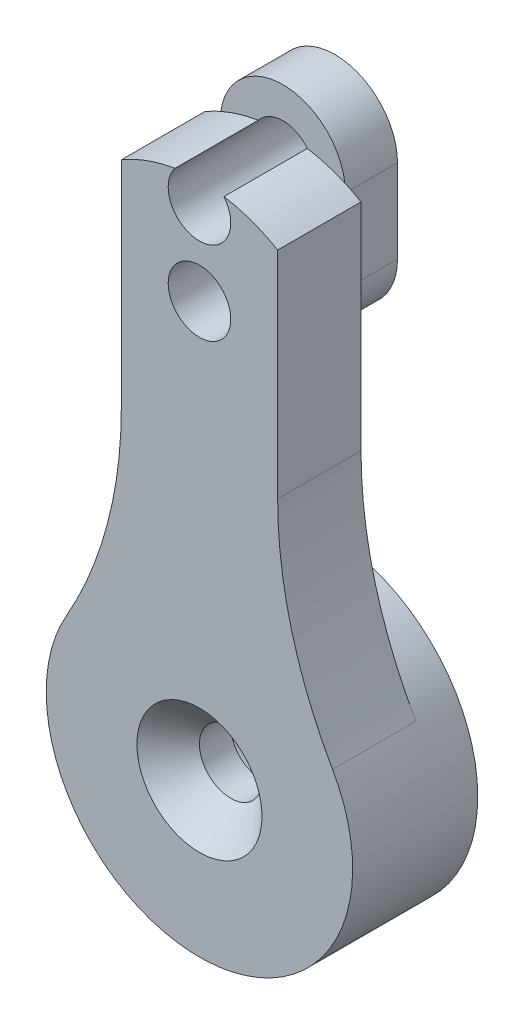
ISO-10303-21;
HEADER;
FILE_DESCRIPTION(('STEP AP214'),'2;1');
FILE_NAME('part.step','',(''),(''),'','','');
FILE_SCHEMA(('AUTOMOTIVE_DESIGN { 1 0 10303 214 1 1 1 1 }'));
ENDSEC;
DATA;
#1=APPLICATION_CONTEXT('core data for automotive mechanical design processes');
#2=APPLICATION_PROTOCOL_DEFINITION('international standard','automotive_design',2000,#1);
#3=PRODUCT_CONTEXT('',#1,'mechanical');
#4=PRODUCT('Part','Part','',(#3));
#5=PRODUCT_RELATED_PRODUCT_CATEGORY('part','',(#4));
#6=PRODUCT_DEFINITION_FORMATION('','',#4);
#7=PRODUCT_DEFINITION_CONTEXT('part definition',#1,'design');
#8=PRODUCT_DEFINITION('design','',#6,#7);
#9=PRODUCT_DEFINITION_SHAPE('','',#8);
#10=(LENGTH_UNIT() NAMED_UNIT(*) SI_UNIT(.MILLI.,.METRE.));
#11=(NAMED_UNIT(*) PLANE_ANGLE_UNIT() SI_UNIT($,.RADIAN.));
#12=(NAMED_UNIT(*) SI_UNIT($,.STERADIAN.) SOLID_ANGLE_UNIT());
#13=UNCERTAINTY_MEASURE_WITH_UNIT(LENGTH_MEASURE(1.E-05),#10,'distance_accuracy_value','');
#14=(GEOMETRIC_REPRESENTATION_CONTEXT(3) GLOBAL_UNCERTAINTY_ASSIGNED_CONTEXT((#13)) GLOBAL_UNIT_ASSIGNED_CONTEXT((#10,
#11,#12)) REPRESENTATION_CONTEXT('',''));
#15=CARTESIAN_POINT('',(0.,0.,0.));
#16=DIRECTION('',(0.,0.,1.));
#17=DIRECTION('',(1.,0.,0.));
#18=AXIS2_PLACEMENT_3D('',#15,#16,#17);
#19=CARTESIAN_POINT('',(7.35,0.,4.));
#20=DIRECTION('',(0.,0.,1.));
#21=DIRECTION('',(1.,0.,0.));
#22=AXIS2_PLACEMENT_3D('',#19,#20,#21);
#23=PLANE('',#22);
#24=CARTESIAN_POINT('',(0.,0.,4.00000000000001));
#25=DIRECTION('',(0.,0.,-1.));
#26=DIRECTION('',(-1.,0.,0.));
#27=AXIS2_PLACEMENT_3D('',#24,#25,#26);
#28=CIRCLE('',#27,3.);
#29=CARTESIAN_POINT('',(-3.,0.,4.00000000000001));
#30=VERTEX_POINT('',#29);
#31=EDGE_CURVE('E326',#30,#30,#28,.T.);
#32=ORIENTED_EDGE('',*,*,#31,.T.);
#33=EDGE_LOOP('',(#32));
#34=FACE_BOUND('',#33,.T.);
#35=CARTESIAN_POINT('',(0.,19.9,4.00000000000001));
#36=DIRECTION('',(0.,0.,-1.));
#37=DIRECTION('',(-1.,0.,0.));
#38=AXIS2_PLACEMENT_3D('',#35,#36,#37);
#39=CIRCLE('',#38,1.49999999999999);
#40=CARTESIAN_POINT('',(-1.49999999999999,19.9,4.00000000000001));
#41=VERTEX_POINT('',#40);
#42=EDGE_CURVE('E297',#41,#41,#39,.T.);
#43=ORIENTED_EDGE('',*,*,#42,.T.);
#44=EDGE_LOOP('',(#43));
#45=FACE_BOUND('',#44,.T.);
#46=CARTESIAN_POINT('',(0.,17.5786077482884,4.));
#47=DIRECTION('',(0.,0.,-1.));
#48=DIRECTION('',(-1.,0.,0.));
#49=AXIS2_PLACEMENT_3D('',#46,#47,#48);
#50=CIRCLE('',#49,7.35);
#51=CARTESIAN_POINT('',(1.1734701980635,24.8343274020689,4.00000000000001));
#52=VERTEX_POINT('',#51);
#53=CARTESIAN_POINT('',(3.75,23.9,4.));
#54=VERTEX_POINT('',#53);
#55=EDGE_CURVE('E156',#52,#54,#50,.T.);
#56=ORIENTED_EDGE('',*,*,#55,.F.);
#57=CARTESIAN_POINT('',(0.,23.9,4.00000000000001));
#58=DIRECTION('',(0.,0.,-1.));
#59=DIRECTION('',(-1.,0.,0.));
#60=AXIS2_PLACEMENT_3D('',#57,#58,#59);
#61=CIRCLE('',#60,1.49999999999999);
#62=CARTESIAN_POINT('',(-1.1734701980635,24.8343274020689,4.00000000000001));
#63=VERTEX_POINT('',#62);
#64=EDGE_CURVE('E140',#52,#63,#61,.T.);
#65=ORIENTED_EDGE('',*,*,#64,.T.);
#66=CARTESIAN_POINT('',(-3.75,23.9,4.));
#67=VERTEX_POINT('',#66);
#68=EDGE_CURVE('E154',#67,#63,#50,.T.);
#69=ORIENTED_EDGE('',*,*,#68,.F.);
#70=DIRECTION('',(0.,1.,0.));
#71=VECTOR('',#70,1.);
#72=CARTESIAN_POINT('',(-3.75,6.32139225171164,4.));
#73=LINE('',#72,#71);
#74=CARTESIAN_POINT('',(-3.75,13.5631854665488,4.));
#75=VERTEX_POINT('',#74);
#76=EDGE_CURVE('E166',#75,#67,#73,.T.);
#77=ORIENTED_EDGE('',*,*,#76,.F.);
#78=CARTESIAN_POINT('',(-23.75,13.5631854665488,4.));
#79=DIRECTION('',(0.,0.,1.));
#80=DIRECTION('',(1.,0.,0.));
#81=AXIS2_PLACEMENT_3D('',#78,#79,#80);
#82=CIRCLE('',#81,20.);
#83=CARTESIAN_POINT('',(-6.38254113345521,3.64495112172335,4.));
#84=VERTEX_POINT('',#83);
#85=EDGE_CURVE('E11',#75,#84,#82,.F.);
#86=ORIENTED_EDGE('',*,*,#85,.T.);
#87=CARTESIAN_POINT('',(0.,0.,4.));
#88=DIRECTION('',(0.,0.,-1.));
#89=DIRECTION('',(-1.,0.,0.));
#90=AXIS2_PLACEMENT_3D('',#87,#88,#89);
#91=CIRCLE('',#90,7.35);
#92=CARTESIAN_POINT('',(6.38254113345521,3.64495112172335,4.));
#93=VERTEX_POINT('',#92);
#94=EDGE_CURVE('E191',#93,#84,#91,.T.);
#95=ORIENTED_EDGE('',*,*,#94,.F.);
#96=CARTESIAN_POINT('',(23.75,13.5631854665488,4.));
#97=DIRECTION('',(0.,0.,1.));
#98=DIRECTION('',(1.,0.,0.));
#99=AXIS2_PLACEMENT_3D('',#96,#97,#98);
#100=CIRCLE('',#99,20.);
#101=CARTESIAN_POINT('',(3.75,13.5631854665488,4.));
#102=VERTEX_POINT('',#101);
#103=EDGE_CURVE('E217',#93,#102,#100,.F.);
#104=ORIENTED_EDGE('',*,*,#103,.T.);
#105=DIRECTION('',(0.,1.,0.));
#106=VECTOR('',#105,1.);
#107=CARTESIAN_POINT('',(3.75,6.32139225171164,4.));
#108=LINE('',#107,#106);
#109=EDGE_CURVE('E170',#102,#54,#108,.T.);
#110=ORIENTED_EDGE('',*,*,#109,.T.);
#111=EDGE_LOOP('',(#56,#65,#69,#77,#86,#95,#104,#110));
#112=FACE_BOUND('',#111,.T.);
#113=ADVANCED_FACE('F43',(#34,#45,#112),#23,.T.);
#114=CARTESIAN_POINT('',(0.,17.5786077482884,4.));
#115=DIRECTION('',(0.,0.,-1.));
#116=DIRECTION('',(-1.,0.,0.));
#117=AXIS2_PLACEMENT_3D('',#114,#115,#116);
#118=CYLINDRICAL_SURFACE('',#117,7.35);
#119=DIRECTION('',(0.,0.,-1.));
#120=VECTOR('',#119,1.);
#121=CARTESIAN_POINT('',(1.1734701980635,24.8343274020689,0.750000000000002));
#122=LINE('',#121,#120);
#123=CARTESIAN_POINT('',(1.1734701980635,24.8343274020689,0.));
#124=VERTEX_POINT('',#123);
#125=EDGE_CURVE('E148',#52,#124,#122,.T.);
#126=ORIENTED_EDGE('',*,*,#125,.F.);
#127=ORIENTED_EDGE('',*,*,#55,.T.);
#128=DIRECTION('',(0.,0.,-1.));
#129=VECTOR('',#128,1.);
#130=CARTESIAN_POINT('',(3.75,23.9,4.));
#131=LINE('',#130,#129);
#132=CARTESIAN_POINT('',(3.75,23.9,0.));
#133=VERTEX_POINT('',#132);
#134=EDGE_CURVE('E175',#54,#133,#131,.T.);
#135=ORIENTED_EDGE('',*,*,#134,.T.);
#136=CARTESIAN_POINT('',(0.,17.5786077482884,0.));
#137=DIRECTION('',(0.,0.,1.));
#138=DIRECTION('',(1.,0.,0.));
#139=AXIS2_PLACEMENT_3D('',#136,#137,#138);
#140=CIRCLE('',#139,7.35);
#141=CARTESIAN_POINT('',(2.97315640270276,24.3004260294581,0.));
#142=VERTEX_POINT('',#141);
#143=EDGE_CURVE('E224',#133,#142,#140,.T.);
#144=ORIENTED_EDGE('',*,*,#143,.T.);
#145=EDGE_CURVE('E228',#142,#124,#140,.T.);
#146=ORIENTED_EDGE('',*,*,#145,.T.);
#147=EDGE_LOOP('',(#126,#127,#135,#144,#146));
#148=FACE_BOUND('',#147,.T.);
#149=ADVANCED_FACE('F238',(#148),#118,.T.);
#150=CARTESIAN_POINT('',(-3.75,6.32139225171164,0.));
#151=DIRECTION('',(0.,0.,-1.));
#152=DIRECTION('',(-1.,0.,0.));
#153=AXIS2_PLACEMENT_3D('',#150,#151,#152);
#154=PLANE('',#153);
#155=DIRECTION('',(0.,-1.,0.));
#156=VECTOR('',#155,1.);
#157=CARTESIAN_POINT('',(3.,19.9,0.));
#158=LINE('',#157,#156);
#159=CARTESIAN_POINT('',(3.,23.9,0.));
#160=VERTEX_POINT('',#159);
#161=CARTESIAN_POINT('',(3.,19.9,0.));
#162=VERTEX_POINT('',#161);
#163=EDGE_CURVE('E245',#160,#162,#158,.T.);
#164=ORIENTED_EDGE('',*,*,#163,.F.);
#165=CARTESIAN_POINT('',(0.,23.9,0.));
#166=DIRECTION('',(0.,0.,-1.));
#167=DIRECTION('',(-1.,0.,0.));
#168=AXIS2_PLACEMENT_3D('',#165,#166,#167);
#169=CIRCLE('',#168,3.);
#170=EDGE_CURVE('E149',#160,#142,#169,.F.);
#171=ORIENTED_EDGE('',*,*,#170,.T.);
#172=ORIENTED_EDGE('',*,*,#143,.F.);
#173=DIRECTION('',(0.,1.,0.));
#174=VECTOR('',#173,1.);
#175=CARTESIAN_POINT('',(3.75,6.32139225171164,0.));
#176=LINE('',#175,#174);
#177=CARTESIAN_POINT('',(3.75,13.5631854665488,0.));
#178=VERTEX_POINT('',#177);
#179=EDGE_CURVE('E179',#178,#133,#176,.T.);
#180=ORIENTED_EDGE('',*,*,#179,.F.);
#181=CARTESIAN_POINT('',(23.75,13.5631854665488,0.));
#182=DIRECTION('',(0.,0.,-1.));
#183=DIRECTION('',(-1.,0.,0.));
#184=AXIS2_PLACEMENT_3D('',#181,#182,#183);
#185=CIRCLE('',#184,20.);
#186=CARTESIAN_POINT('',(6.38254113345521,3.64495112172335,0.));
#187=VERTEX_POINT('',#186);
#188=EDGE_CURVE('E213',#178,#187,#185,.F.);
#189=ORIENTED_EDGE('',*,*,#188,.T.);
#190=CARTESIAN_POINT('',(0.,0.,0.));
#191=DIRECTION('',(0.,0.,1.));
#192=DIRECTION('',(1.,0.,0.));
#193=AXIS2_PLACEMENT_3D('',#190,#191,#192);
#194=CIRCLE('',#193,7.35);
#195=CARTESIAN_POINT('',(-6.38254113345521,3.64495112172335,0.));
#196=VERTEX_POINT('',#195);
#197=EDGE_CURVE('E185',#187,#196,#194,.T.);
#198=ORIENTED_EDGE('',*,*,#197,.T.);
#199=CARTESIAN_POINT('',(-23.75,13.5631854665488,0.));
#200=DIRECTION('',(0.,0.,-1.));
#201=DIRECTION('',(-1.,0.,0.));
#202=AXIS2_PLACEMENT_3D('',#199,#200,#201);
#203=CIRCLE('',#202,20.);
#204=CARTESIAN_POINT('',(-3.75,13.5631854665488,0.));
#205=VERTEX_POINT('',#204);
#206=EDGE_CURVE('E52',#196,#205,#203,.F.);
#207=ORIENTED_EDGE('',*,*,#206,.T.);
#208=DIRECTION('',(0.,1.,0.));
#209=VECTOR('',#208,1.);
#210=CARTESIAN_POINT('',(-3.75,6.32139225171164,0.));
#211=LINE('',#210,#209);
#212=CARTESIAN_POINT('',(-3.75,23.9,0.));
#213=VERTEX_POINT('',#212);
#214=EDGE_CURVE('E183',#205,#213,#211,.T.);
#215=ORIENTED_EDGE('',*,*,#214,.T.);
#216=CARTESIAN_POINT('',(-2.97315640270276,24.3004260294581,0.));
#217=VERTEX_POINT('',#216);
#218=EDGE_CURVE('E182',#217,#213,#140,.T.);
#219=ORIENTED_EDGE('',*,*,#218,.F.);
#220=CARTESIAN_POINT('',(0.,23.9,0.));
#221=DIRECTION('',(0.,0.,-1.));
#222=DIRECTION('',(1.,0.,0.));
#223=AXIS2_PLACEMENT_3D('',#220,#221,#222);
#224=CIRCLE('',#223,3.);
#225=CARTESIAN_POINT('',(-3.,23.9,0.));
#226=VERTEX_POINT('',#225);
#227=EDGE_CURVE('E285',#226,#217,#224,.T.);
#228=ORIENTED_EDGE('',*,*,#227,.F.);
#229=DIRECTION('',(0.,1.,0.));
#230=VECTOR('',#229,1.);
#231=CARTESIAN_POINT('',(-3.,23.9,0.));
#232=LINE('',#231,#230);
#233=CARTESIAN_POINT('',(-3.,19.9,0.));
#234=VERTEX_POINT('',#233);
#235=EDGE_CURVE('E275',#234,#226,#232,.T.);
#236=ORIENTED_EDGE('',*,*,#235,.F.);
#237=CARTESIAN_POINT('',(0.,19.9,0.));
#238=DIRECTION('',(0.,0.,-1.));
#239=DIRECTION('',(1.,0.,0.));
#240=AXIS2_PLACEMENT_3D('',#237,#238,#239);
#241=CIRCLE('',#240,3.);
#242=EDGE_CURVE('E279',#162,#234,#241,.T.);
#243=ORIENTED_EDGE('',*,*,#242,.F.);
#244=EDGE_LOOP('',(#164,#171,#172,#180,#189,#198,#207,#215,#219,#228,#236,#243));
#245=FACE_BOUND('',#244,.T.);
#246=ADVANCED_FACE('F243',(#245),#154,.T.);
#247=CARTESIAN_POINT('',(0.,0.,4.));
#248=DIRECTION('',(0.,0.,-1.));
#249=DIRECTION('',(-1.,0.,0.));
#250=AXIS2_PLACEMENT_3D('',#247,#248,#249);
#251=CYLINDRICAL_SURFACE('',#250,7.35);
#252=ORIENTED_EDGE('',*,*,#197,.F.);
#253=DIRECTION('',(0.,0.,-1.));
#254=VECTOR('',#253,1.);
#255=CARTESIAN_POINT('',(6.38254113345521,3.64495112172335,4.));
#256=LINE('',#255,#254);
#257=EDGE_CURVE('E208',#187,#93,#256,.F.);
#258=ORIENTED_EDGE('',*,*,#257,.T.);
#259=ORIENTED_EDGE('',*,*,#94,.T.);
#260=DIRECTION('',(0.,0.,-1.));
#261=VECTOR('',#260,1.);
#262=CARTESIAN_POINT('',(-6.38254113345521,3.64495112172335,4.));
#263=LINE('',#262,#261);
#264=EDGE_CURVE('E204',#84,#196,#263,.T.);
#265=ORIENTED_EDGE('',*,*,#264,.T.);
#266=EDGE_LOOP('',(#252,#258,#259,#265));
#267=FACE_BOUND('',#266,.T.);
#268=CARTESIAN_POINT('',(0.,0.,-2.));
#269=DIRECTION('',(0.,0.,-1.));
#270=DIRECTION('',(-1.,0.,0.));
#271=AXIS2_PLACEMENT_3D('',#268,#269,#270);
#272=CIRCLE('',#271,7.35);
#273=CARTESIAN_POINT('',(-7.35,0.,-2.));
#274=VERTEX_POINT('',#273);
#275=EDGE_CURVE('E187',#274,#274,#272,.T.);
#276=ORIENTED_EDGE('',*,*,#275,.F.);
#277=EDGE_LOOP('',(#276));
#278=FACE_BOUND('',#277,.T.);
#279=ADVANCED_FACE('F361',(#267,#278),#251,.T.);
#280=CARTESIAN_POINT('',(0.,0.,-2.));
#281=DIRECTION('',(0.,0.,-1.));
#282=DIRECTION('',(-1.,0.,0.));
#283=AXIS2_PLACEMENT_3D('',#280,#281,#282);
#284=PLANE('',#283);
#285=CARTESIAN_POINT('',(0.,0.,-2.));
#286=DIRECTION('',(0.,0.,-1.));
#287=DIRECTION('',(-1.,0.,0.));
#288=AXIS2_PLACEMENT_3D('',#285,#286,#287);
#289=CIRCLE('',#288,3.);
#290=CARTESIAN_POINT('',(-3.,0.,-2.));
#291=VERTEX_POINT('',#290);
#292=EDGE_CURVE('E322',#291,#291,#289,.T.);
#293=ORIENTED_EDGE('',*,*,#292,.F.);
#294=EDGE_LOOP('',(#293));
#295=FACE_BOUND('',#294,.T.);
#296=ORIENTED_EDGE('',*,*,#275,.T.);
#297=EDGE_LOOP('',(#296));
#298=FACE_BOUND('',#297,.T.);
#299=ADVANCED_FACE('F358',(#295,#298),#284,.T.);
#300=DIRECTION('',(0.,0.,-1.));
#301=VECTOR('',#300,1.);
#302=CARTESIAN_POINT('',(-1.1734701980635,24.8343274020689,0.750000000000002));
#303=LINE('',#302,#301);
#304=CARTESIAN_POINT('',(-1.1734701980635,24.8343274020689,0.));
#305=VERTEX_POINT('',#304);
#306=EDGE_CURVE('E136',#305,#63,#303,.F.);
#307=ORIENTED_EDGE('',*,*,#306,.F.);
#308=EDGE_CURVE('E229',#305,#217,#140,.T.);
#309=ORIENTED_EDGE('',*,*,#308,.T.);
#310=ORIENTED_EDGE('',*,*,#218,.T.);
#311=DIRECTION('',(0.,0.,-1.));
#312=VECTOR('',#311,1.);
#313=CARTESIAN_POINT('',(-3.75,23.9,4.));
#314=LINE('',#313,#312);
#315=EDGE_CURVE('E164',#67,#213,#314,.T.);
#316=ORIENTED_EDGE('',*,*,#315,.F.);
#317=ORIENTED_EDGE('',*,*,#68,.T.);
#318=EDGE_LOOP('',(#307,#309,#310,#316,#317));
#319=FACE_BOUND('',#318,.T.);
#320=ADVANCED_FACE('F161',(#319),#118,.T.);
#321=CARTESIAN_POINT('',(3.75,6.32139225171164,4.));
#322=DIRECTION('',(1.,0.,0.));
#323=DIRECTION('',(0.,0.,-1.));
#324=AXIS2_PLACEMENT_3D('',#321,#322,#323);
#325=PLANE('',#324);
#326=ORIENTED_EDGE('',*,*,#109,.F.);
#327=DIRECTION('',(0.,0.,1.));
#328=VECTOR('',#327,1.);
#329=CARTESIAN_POINT('',(3.75,13.5631854665488,0.));
#330=LINE('',#329,#328);
#331=EDGE_CURVE('E200',#102,#178,#330,.F.);
#332=ORIENTED_EDGE('',*,*,#331,.T.);
#333=ORIENTED_EDGE('',*,*,#179,.T.);
#334=ORIENTED_EDGE('',*,*,#134,.F.);
#335=EDGE_LOOP('',(#326,#332,#333,#334));
#336=FACE_BOUND('',#335,.T.);
#337=ADVANCED_FACE('F381',(#336),#325,.T.);
#338=CARTESIAN_POINT('',(-3.75,6.32139225171164,4.));
#339=DIRECTION('',(1.,0.,0.));
#340=DIRECTION('',(0.,0.,-1.));
#341=AXIS2_PLACEMENT_3D('',#338,#339,#340);
#342=PLANE('',#341);
#343=ORIENTED_EDGE('',*,*,#214,.F.);
#344=DIRECTION('',(0.,0.,-1.));
#345=VECTOR('',#344,1.);
#346=CARTESIAN_POINT('',(-3.75,13.5631854665488,4.));
#347=LINE('',#346,#345);
#348=EDGE_CURVE('E59',#205,#75,#347,.F.);
#349=ORIENTED_EDGE('',*,*,#348,.T.);
#350=ORIENTED_EDGE('',*,*,#76,.T.);
#351=ORIENTED_EDGE('',*,*,#315,.T.);
#352=EDGE_LOOP('',(#343,#349,#350,#351));
#353=FACE_BOUND('',#352,.T.);
#354=ADVANCED_FACE('F363',(#353),#342,.F.);
#355=CARTESIAN_POINT('',(0.,23.9,-2.5));
#356=DIRECTION('',(0.,0.,1.));
#357=DIRECTION('',(1.,0.,0.));
#358=AXIS2_PLACEMENT_3D('',#355,#356,#357);
#359=CYLINDRICAL_SURFACE('',#358,3.);
#360=ORIENTED_EDGE('',*,*,#227,.T.);
#361=EDGE_CURVE('E254',#217,#142,#224,.T.);
#362=ORIENTED_EDGE('',*,*,#361,.T.);
#363=ORIENTED_EDGE('',*,*,#170,.F.);
#364=DIRECTION('',(0.,0.,1.));
#365=VECTOR('',#364,1.);
#366=CARTESIAN_POINT('',(3.,23.9,-2.5));
#367=LINE('',#366,#365);
#368=CARTESIAN_POINT('',(3.,23.9,-2.5));
#369=VERTEX_POINT('',#368);
#370=EDGE_CURVE('E172',#369,#160,#367,.T.);
#371=ORIENTED_EDGE('',*,*,#370,.F.);
#372=CARTESIAN_POINT('',(0.,23.9,-2.5));
#373=DIRECTION('',(0.,0.,-1.));
#374=DIRECTION('',(1.,0.,0.));
#375=AXIS2_PLACEMENT_3D('',#372,#373,#374);
#376=CIRCLE('',#375,3.);
#377=CARTESIAN_POINT('',(-3.,23.9,-2.5));
#378=VERTEX_POINT('',#377);
#379=EDGE_CURVE('E278',#378,#369,#376,.T.);
#380=ORIENTED_EDGE('',*,*,#379,.F.);
#381=DIRECTION('',(0.,0.,1.));
#382=VECTOR('',#381,1.);
#383=CARTESIAN_POINT('',(-3.,23.9,-2.5));
#384=LINE('',#383,#382);
#385=EDGE_CURVE('E270',#378,#226,#384,.T.);
#386=ORIENTED_EDGE('',*,*,#385,.T.);
#387=EDGE_LOOP('',(#360,#362,#363,#371,#380,#386));
#388=FACE_BOUND('',#387,.T.);
#389=ADVANCED_FACE('F251',(#388),#359,.T.);
#390=CARTESIAN_POINT('',(3.,19.9,-2.5));
#391=DIRECTION('',(-1.,0.,0.));
#392=DIRECTION('',(0.,0.,1.));
#393=AXIS2_PLACEMENT_3D('',#390,#391,#392);
#394=PLANE('',#393);
#395=ORIENTED_EDGE('',*,*,#163,.T.);
#396=DIRECTION('',(0.,0.,1.));
#397=VECTOR('',#396,1.);
#398=CARTESIAN_POINT('',(3.,19.9,-2.5));
#399=LINE('',#398,#397);
#400=CARTESIAN_POINT('',(3.,19.9,-2.5));
#401=VERTEX_POINT('',#400);
#402=EDGE_CURVE('E262',#401,#162,#399,.T.);
#403=ORIENTED_EDGE('',*,*,#402,.F.);
#404=DIRECTION('',(0.,-1.,0.));
#405=VECTOR('',#404,1.);
#406=CARTESIAN_POINT('',(3.,19.9,-2.5));
#407=LINE('',#406,#405);
#408=EDGE_CURVE('E259',#369,#401,#407,.T.);
#409=ORIENTED_EDGE('',*,*,#408,.F.);
#410=ORIENTED_EDGE('',*,*,#370,.T.);
#411=EDGE_LOOP('',(#395,#403,#409,#410));
#412=FACE_BOUND('',#411,.T.);
#413=ADVANCED_FACE('F256',(#412),#394,.F.);
#414=CARTESIAN_POINT('',(0.,19.9,-2.5));
#415=DIRECTION('',(0.,0.,1.));
#416=DIRECTION('',(1.,0.,0.));
#417=AXIS2_PLACEMENT_3D('',#414,#415,#416);
#418=CYLINDRICAL_SURFACE('',#417,3.);
#419=ORIENTED_EDGE('',*,*,#242,.T.);
#420=DIRECTION('',(0.,0.,1.));
#421=VECTOR('',#420,1.);
#422=CARTESIAN_POINT('',(-3.,19.9,-2.5));
#423=LINE('',#422,#421);
#424=CARTESIAN_POINT('',(-3.,19.9,-2.5));
#425=VERTEX_POINT('',#424);
#426=EDGE_CURVE('E265',#425,#234,#423,.T.);
#427=ORIENTED_EDGE('',*,*,#426,.F.);
#428=CARTESIAN_POINT('',(0.,19.9,-2.5));
#429=DIRECTION('',(0.,0.,-1.));
#430=DIRECTION('',(1.,0.,0.));
#431=AXIS2_PLACEMENT_3D('',#428,#429,#430);
#432=CIRCLE('',#431,3.);
#433=EDGE_CURVE('E290',#401,#425,#432,.T.);
#434=ORIENTED_EDGE('',*,*,#433,.F.);
#435=ORIENTED_EDGE('',*,*,#402,.T.);
#436=EDGE_LOOP('',(#419,#427,#434,#435));
#437=FACE_BOUND('',#436,.T.);
#438=ADVANCED_FACE('F390',(#437),#418,.T.);
#439=CARTESIAN_POINT('',(-3.,23.9,-2.5));
#440=DIRECTION('',(1.,0.,0.));
#441=DIRECTION('',(0.,0.,-1.));
#442=AXIS2_PLACEMENT_3D('',#439,#440,#441);
#443=PLANE('',#442);
#444=ORIENTED_EDGE('',*,*,#235,.T.);
#445=ORIENTED_EDGE('',*,*,#385,.F.);
#446=DIRECTION('',(0.,1.,0.));
#447=VECTOR('',#446,1.);
#448=CARTESIAN_POINT('',(-3.,23.9,-2.5));
#449=LINE('',#448,#447);
#450=EDGE_CURVE('E274',#425,#378,#449,.T.);
#451=ORIENTED_EDGE('',*,*,#450,.F.);
#452=ORIENTED_EDGE('',*,*,#426,.T.);
#453=EDGE_LOOP('',(#444,#445,#451,#452));
#454=FACE_BOUND('',#453,.T.);
#455=ADVANCED_FACE('F393',(#454),#443,.F.);
#456=CARTESIAN_POINT('',(0.,23.9,-2.5));
#457=DIRECTION('',(0.,0.,1.));
#458=DIRECTION('',(1.,0.,0.));
#459=AXIS2_PLACEMENT_3D('',#456,#457,#458);
#460=PLANE('',#459);
#461=CARTESIAN_POINT('',(0.,23.9,-2.5));
#462=DIRECTION('',(0.,0.,-1.));
#463=DIRECTION('',(-1.,0.,0.));
#464=AXIS2_PLACEMENT_3D('',#461,#462,#463);
#465=CIRCLE('',#464,1.49999999999999);
#466=CARTESIAN_POINT('',(-1.49999999999999,23.9,-2.5));
#467=VERTEX_POINT('',#466);
#468=EDGE_CURVE('E158',#467,#467,#465,.T.);
#469=ORIENTED_EDGE('',*,*,#468,.F.);
#470=EDGE_LOOP('',(#469));
#471=FACE_BOUND('',#470,.T.);
#472=CARTESIAN_POINT('',(0.,19.9,-2.5));
#473=DIRECTION('',(0.,0.,-1.));
#474=DIRECTION('',(-1.,0.,0.));
#475=AXIS2_PLACEMENT_3D('',#472,#473,#474);
#476=CIRCLE('',#475,1.49999999999999);
#477=CARTESIAN_POINT('',(-1.49999999999999,19.9,-2.5));
#478=VERTEX_POINT('',#477);
#479=EDGE_CURVE('E301',#478,#478,#476,.T.);
#480=ORIENTED_EDGE('',*,*,#479,.F.);
#481=EDGE_LOOP('',(#480));
#482=FACE_BOUND('',#481,.T.);
#483=ORIENTED_EDGE('',*,*,#379,.T.);
#484=ORIENTED_EDGE('',*,*,#408,.T.);
#485=ORIENTED_EDGE('',*,*,#433,.T.);
#486=ORIENTED_EDGE('',*,*,#450,.T.);
#487=EDGE_LOOP('',(#483,#484,#485,#486));
#488=FACE_BOUND('',#487,.T.);
#489=ADVANCED_FACE('F397',(#471,#482,#488),#460,.F.);
#490=CARTESIAN_POINT('',(0.,23.9,0.));
#491=DIRECTION('',(0.,0.,1.));
#492=DIRECTION('',(1.,0.,0.));
#493=AXIS2_PLACEMENT_3D('',#490,#491,#492);
#494=PLANE('',#493);
#495=CARTESIAN_POINT('',(0.,23.9,0.));
#496=DIRECTION('',(0.,0.,1.));
#497=DIRECTION('',(1.,0.,0.));
#498=AXIS2_PLACEMENT_3D('',#495,#496,#497);
#499=CIRCLE('',#498,1.49999999999999);
#500=EDGE_CURVE('E143',#124,#305,#499,.T.);
#501=ORIENTED_EDGE('',*,*,#500,.F.);
#502=ORIENTED_EDGE('',*,*,#145,.F.);
#503=ORIENTED_EDGE('',*,*,#361,.F.);
#504=ORIENTED_EDGE('',*,*,#308,.F.);
#505=EDGE_LOOP('',(#501,#502,#503,#504));
#506=FACE_BOUND('',#505,.T.);
#507=ADVANCED_FACE('F399',(#506),#494,.T.);
#508=CARTESIAN_POINT('',(0.,19.9,-2.5));
#509=DIRECTION('',(0.,0.,-1.));
#510=DIRECTION('',(-1.,0.,0.));
#511=AXIS2_PLACEMENT_3D('',#508,#509,#510);
#512=CYLINDRICAL_SURFACE('',#511,1.49999999999999);
#513=ORIENTED_EDGE('',*,*,#42,.F.);
#514=EDGE_LOOP('',(#513));
#515=FACE_BOUND('',#514,.T.);
#516=ORIENTED_EDGE('',*,*,#479,.T.);
#517=EDGE_LOOP('',(#516));
#518=FACE_BOUND('',#517,.T.);
#519=ADVANCED_FACE('F402',(#515,#518),#512,.F.);
#520=CARTESIAN_POINT('',(0.,23.9,-2.5));
#521=DIRECTION('',(0.,0.,-1.));
#522=DIRECTION('',(-1.,0.,0.));
#523=AXIS2_PLACEMENT_3D('',#520,#521,#522);
#524=CYLINDRICAL_SURFACE('',#523,1.49999999999999);
#525=ORIENTED_EDGE('',*,*,#125,.T.);
#526=ORIENTED_EDGE('',*,*,#500,.T.);
#527=ORIENTED_EDGE('',*,*,#306,.T.);
#528=ORIENTED_EDGE('',*,*,#64,.F.);
#529=EDGE_LOOP('',(#525,#526,#527,#528));
#530=FACE_BOUND('',#529,.T.);
#531=ORIENTED_EDGE('',*,*,#468,.T.);
#532=EDGE_LOOP('',(#531));
#533=FACE_BOUND('',#532,.T.);
#534=ADVANCED_FACE('F138',(#530,#533),#524,.F.);
#535=CARTESIAN_POINT('',(0.,0.,2.50000000000002));
#536=DIRECTION('',(0.,0.,1.));
#537=DIRECTION('',(1.,0.,0.));
#538=AXIS2_PLACEMENT_3D('',#535,#536,#537);
#539=CONICAL_SURFACE('',#538,1.50000000000001,0.785398163397449);
#540=ORIENTED_EDGE('',*,*,#31,.F.);
#541=EDGE_LOOP('',(#540));
#542=FACE_BOUND('',#541,.T.);
#543=CARTESIAN_POINT('',(0.,0.,2.50000000000002));
#544=DIRECTION('',(0.,0.,-1.));
#545=DIRECTION('',(-1.,0.,0.));
#546=AXIS2_PLACEMENT_3D('',#543,#544,#545);
#547=CIRCLE('',#546,1.50000000000001);
#548=CARTESIAN_POINT('',(-1.50000000000001,0.,2.50000000000002));
#549=VERTEX_POINT('',#548);
#550=EDGE_CURVE('E310',#549,#549,#547,.T.);
#551=ORIENTED_EDGE('',*,*,#550,.T.);
#552=EDGE_LOOP('',(#551));
#553=FACE_BOUND('',#552,.T.);
#554=ADVANCED_FACE('F333',(#542,#553),#539,.F.);
#555=CARTESIAN_POINT('',(0.,0.,-2.));
#556=DIRECTION('',(0.,0.,-1.));
#557=DIRECTION('',(-1.,0.,0.));
#558=AXIS2_PLACEMENT_3D('',#555,#556,#557);
#559=CYLINDRICAL_SURFACE('',#558,1.50000000000001);
#560=ORIENTED_EDGE('',*,*,#550,.F.);
#561=EDGE_LOOP('',(#560));
#562=FACE_BOUND('',#561,.T.);
#563=CARTESIAN_POINT('',(0.,0.,0.999999999999999));
#564=DIRECTION('',(0.,0.,-1.));
#565=DIRECTION('',(-1.,0.,0.));
#566=AXIS2_PLACEMENT_3D('',#563,#564,#565);
#567=CIRCLE('',#566,1.50000000000001);
#568=CARTESIAN_POINT('',(-1.50000000000001,0.,0.999999999999999));
#569=VERTEX_POINT('',#568);
#570=EDGE_CURVE('E314',#569,#569,#567,.T.);
#571=ORIENTED_EDGE('',*,*,#570,.T.);
#572=EDGE_LOOP('',(#571));
#573=FACE_BOUND('',#572,.T.);
#574=ADVANCED_FACE('F336',(#562,#573),#559,.F.);
#575=CARTESIAN_POINT('',(1.50000000000001,0.,0.999999999999999));
#576=DIRECTION('',(0.,0.,1.));
#577=DIRECTION('',(1.,0.,0.));
#578=AXIS2_PLACEMENT_3D('',#575,#576,#577);
#579=PLANE('',#578);
#580=ORIENTED_EDGE('',*,*,#570,.F.);
#581=EDGE_LOOP('',(#580));
#582=FACE_BOUND('',#581,.T.);
#583=CARTESIAN_POINT('',(0.,0.,0.999999999999999));
#584=DIRECTION('',(0.,0.,-1.));
#585=DIRECTION('',(-1.,0.,0.));
#586=AXIS2_PLACEMENT_3D('',#583,#584,#585);
#587=CIRCLE('',#586,3.);
#588=CARTESIAN_POINT('',(-3.,0.,0.999999999999999));
#589=VERTEX_POINT('',#588);
#590=EDGE_CURVE('E318',#589,#589,#587,.T.);
#591=ORIENTED_EDGE('',*,*,#590,.T.);
#592=EDGE_LOOP('',(#591));
#593=FACE_BOUND('',#592,.T.);
#594=ADVANCED_FACE('F342',(#582,#593),#579,.F.);
#595=CARTESIAN_POINT('',(0.,0.,-2.));
#596=DIRECTION('',(0.,0.,-1.));
#597=DIRECTION('',(-1.,0.,0.));
#598=AXIS2_PLACEMENT_3D('',#595,#596,#597);
#599=CYLINDRICAL_SURFACE('',#598,3.);
#600=ORIENTED_EDGE('',*,*,#590,.F.);
#601=EDGE_LOOP('',(#600));
#602=FACE_BOUND('',#601,.T.);
#603=ORIENTED_EDGE('',*,*,#292,.T.);
#604=EDGE_LOOP('',(#603));
#605=FACE_BOUND('',#604,.T.);
#606=ADVANCED_FACE('F348',(#602,#605),#599,.F.);
#607=CARTESIAN_POINT('',(23.75,13.5631854665488,4.));
#608=DIRECTION('',(0.,0.,-1.));
#609=DIRECTION('',(-1.,0.,0.));
#610=AXIS2_PLACEMENT_3D('',#607,#608,#609);
#611=CYLINDRICAL_SURFACE('',#610,20.);
#612=ORIENTED_EDGE('',*,*,#103,.F.);
#613=ORIENTED_EDGE('',*,*,#257,.F.);
#614=ORIENTED_EDGE('',*,*,#188,.F.);
#615=ORIENTED_EDGE('',*,*,#331,.F.);
#616=EDGE_LOOP('',(#612,#613,#614,#615));
#617=FACE_BOUND('',#616,.T.);
#618=ADVANCED_FACE('F354',(#617),#611,.F.);
#619=CARTESIAN_POINT('',(-23.75,13.5631854665488,4.));
#620=DIRECTION('',(0.,0.,-1.));
#621=DIRECTION('',(-1.,0.,0.));
#622=AXIS2_PLACEMENT_3D('',#619,#620,#621);
#623=CYLINDRICAL_SURFACE('',#622,20.);
#624=ORIENTED_EDGE('',*,*,#85,.F.);
#625=ORIENTED_EDGE('',*,*,#348,.F.);
#626=ORIENTED_EDGE('',*,*,#206,.F.);
#627=ORIENTED_EDGE('',*,*,#264,.F.);
#628=EDGE_LOOP('',(#624,#625,#626,#627));
#629=FACE_BOUND('',#628,.T.);
#630=ADVANCED_FACE('F45',(#629),#623,.F.);
#631=CLOSED_SHELL('',(#113,#149,#246,#279,#299,#320,#337,#354,#389,#413,#438,#455,#489,#507,
#519,#534,#554,#574,#594,#606,#618,#630));
#632=MANIFOLD_SOLID_BREP('B2',#631);
#633=ADVANCED_BREP_SHAPE_REPRESENTATION('',(#18,#632),#14);
#634=SHAPE_DEFINITION_REPRESENTATION(#9,#633);
ENDSEC;
END-ISO-10303-21;
